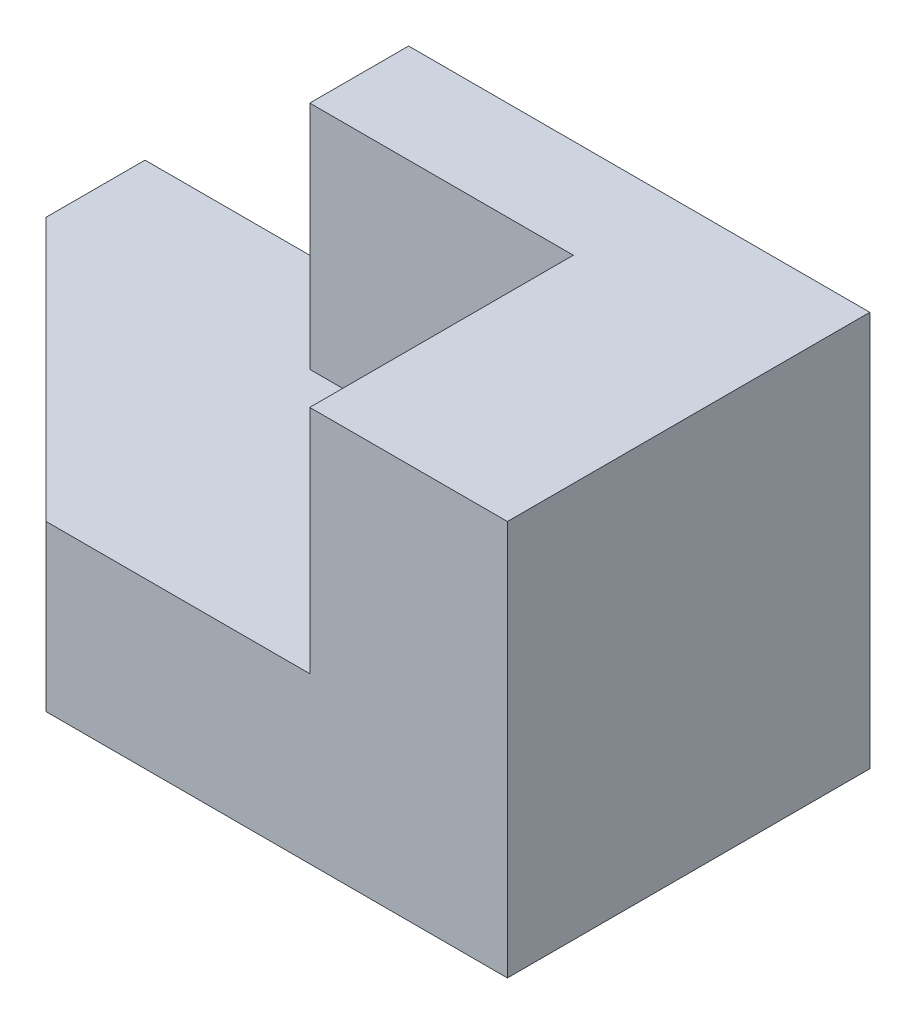
ISO-10303-21;
HEADER;
FILE_DESCRIPTION(('STEP AP214'),'2;1');
FILE_NAME('part.step','',(''),(''),'','','');
FILE_SCHEMA(('AUTOMOTIVE_DESIGN { 1 0 10303 214 1 1 1 1 }'));
ENDSEC;
DATA;
#1=APPLICATION_CONTEXT('core data for automotive mechanical design processes');
#2=APPLICATION_PROTOCOL_DEFINITION('international standard','automotive_design',2000,#1);
#3=PRODUCT_CONTEXT('',#1,'mechanical');
#4=PRODUCT('Part','Part','',(#3));
#5=PRODUCT_RELATED_PRODUCT_CATEGORY('part','',(#4));
#6=PRODUCT_DEFINITION_FORMATION('','',#4);
#7=PRODUCT_DEFINITION_CONTEXT('part definition',#1,'design');
#8=PRODUCT_DEFINITION('design','',#6,#7);
#9=PRODUCT_DEFINITION_SHAPE('','',#8);
#10=(LENGTH_UNIT() NAMED_UNIT(*) SI_UNIT(.MILLI.,.METRE.));
#11=(NAMED_UNIT(*) PLANE_ANGLE_UNIT() SI_UNIT($,.RADIAN.));
#12=(NAMED_UNIT(*) SI_UNIT($,.STERADIAN.) SOLID_ANGLE_UNIT());
#13=UNCERTAINTY_MEASURE_WITH_UNIT(LENGTH_MEASURE(1.E-05),#10,'distance_accuracy_value','');
#14=(GEOMETRIC_REPRESENTATION_CONTEXT(3) GLOBAL_UNCERTAINTY_ASSIGNED_CONTEXT((#13)) GLOBAL_UNIT_ASSIGNED_CONTEXT((#10,
#11,#12)) REPRESENTATION_CONTEXT('',''));
#15=CARTESIAN_POINT('',(0.,0.,0.));
#16=DIRECTION('',(0.,0.,1.));
#17=DIRECTION('',(1.,0.,0.));
#18=AXIS2_PLACEMENT_3D('',#15,#16,#17);
#19=CARTESIAN_POINT('',(0.,25.,55.));
#20=DIRECTION('',(1.,0.,0.));
#21=DIRECTION('',(0.,1.,0.));
#22=AXIS2_PLACEMENT_3D('',#19,#20,#21);
#23=PLANE('',#22);
#24=DIRECTION('',(0.,0.,-1.));
#25=VECTOR('',#24,1.);
#26=CARTESIAN_POINT('',(0.,25.,55.));
#27=LINE('',#26,#25);
#28=CARTESIAN_POINT('',(0.,25.,15.));
#29=VERTEX_POINT('',#28);
#30=CARTESIAN_POINT('',(0.,25.,0.));
#31=VERTEX_POINT('',#30);
#32=EDGE_CURVE('E11',#29,#31,#27,.T.);
#33=ORIENTED_EDGE('',*,*,#32,.F.);
#34=DIRECTION('',(0.,1.,0.));
#35=VECTOR('',#34,1.);
#36=CARTESIAN_POINT('',(0.,60.,15.));
#37=LINE('',#36,#35);
#38=CARTESIAN_POINT('',(0.,60.,15.));
#39=VERTEX_POINT('',#38);
#40=EDGE_CURVE('E165',#29,#39,#37,.T.);
#41=ORIENTED_EDGE('',*,*,#40,.T.);
#42=DIRECTION('',(0.,0.,-1.));
#43=VECTOR('',#42,1.);
#44=CARTESIAN_POINT('',(0.,60.,15.));
#45=LINE('',#44,#43);
#46=CARTESIAN_POINT('',(0.,60.,0.));
#47=VERTEX_POINT('',#46);
#48=EDGE_CURVE('E172',#39,#47,#45,.T.);
#49=ORIENTED_EDGE('',*,*,#48,.T.);
#50=DIRECTION('',(0.,-1.,0.));
#51=VECTOR('',#50,1.);
#52=CARTESIAN_POINT('',(0.,25.,0.));
#53=LINE('',#52,#51);
#54=EDGE_CURVE('E126',#47,#31,#53,.T.);
#55=ORIENTED_EDGE('',*,*,#54,.T.);
#56=EDGE_LOOP('',(#33,#41,#49,#55));
#57=FACE_BOUND('',#56,.T.);
#58=ADVANCED_FACE('F40',(#57),#23,.F.);
#59=CARTESIAN_POINT('',(40.,25.,55.));
#60=DIRECTION('',(0.,-1.,0.));
#61=DIRECTION('',(1.,0.,0.));
#62=AXIS2_PLACEMENT_3D('',#59,#60,#61);
#63=PLANE('',#62);
#64=DIRECTION('',(0.,0.,-1.));
#65=VECTOR('',#64,1.);
#66=CARTESIAN_POINT('',(40.,25.,55.));
#67=LINE('',#66,#65);
#68=CARTESIAN_POINT('',(40.,25.,55.));
#69=VERTEX_POINT('',#68);
#70=CARTESIAN_POINT('',(40.,25.,15.));
#71=VERTEX_POINT('',#70);
#72=EDGE_CURVE('E195',#69,#71,#67,.T.);
#73=ORIENTED_EDGE('',*,*,#72,.T.);
#74=DIRECTION('',(-1.,0.,0.));
#75=VECTOR('',#74,1.);
#76=CARTESIAN_POINT('',(0.,25.,15.));
#77=LINE('',#76,#75);
#78=EDGE_CURVE('E162',#71,#29,#77,.T.);
#79=ORIENTED_EDGE('',*,*,#78,.T.);
#80=ORIENTED_EDGE('',*,*,#32,.T.);
#81=DIRECTION('',(-1.,0.,0.));
#82=VECTOR('',#81,1.);
#83=CARTESIAN_POINT('',(0.,25.,0.));
#84=LINE('',#83,#82);
#85=CARTESIAN_POINT('',(-40.,25.,0.));
#86=VERTEX_POINT('',#85);
#87=EDGE_CURVE('E151',#31,#86,#84,.T.);
#88=ORIENTED_EDGE('',*,*,#87,.T.);
#89=DIRECTION('',(0.,0.,1.));
#90=VECTOR('',#89,1.);
#91=CARTESIAN_POINT('',(-40.,25.,0.));
#92=LINE('',#91,#90);
#93=CARTESIAN_POINT('',(-40.,25.,15.));
#94=VERTEX_POINT('',#93);
#95=EDGE_CURVE('E134',#86,#94,#92,.T.);
#96=ORIENTED_EDGE('',*,*,#95,.T.);
#97=DIRECTION('',(0.707106781186547,0.,0.707106781186548));
#98=VECTOR('',#97,1.);
#99=CARTESIAN_POINT('',(-40.,25.,15.));
#100=LINE('',#99,#98);
#101=CARTESIAN_POINT('',(0.,25.,55.));
#102=VERTEX_POINT('',#101);
#103=EDGE_CURVE('E148',#94,#102,#100,.T.);
#104=ORIENTED_EDGE('',*,*,#103,.T.);
#105=DIRECTION('',(-1.,0.,0.));
#106=VECTOR('',#105,1.);
#107=CARTESIAN_POINT('',(40.,25.,55.));
#108=LINE('',#107,#106);
#109=EDGE_CURVE('E176',#69,#102,#108,.T.);
#110=ORIENTED_EDGE('',*,*,#109,.F.);
#111=EDGE_LOOP('',(#73,#79,#80,#88,#96,#104,#110));
#112=FACE_BOUND('',#111,.T.);
#113=ADVANCED_FACE('F42',(#112),#63,.F.);
#114=CARTESIAN_POINT('',(0.,0.,55.));
#115=DIRECTION('',(0.,1.,0.));
#116=DIRECTION('',(0.,0.,1.));
#117=AXIS2_PLACEMENT_3D('',#114,#115,#116);
#118=PLANE('',#117);
#119=DIRECTION('',(1.,0.,0.));
#120=VECTOR('',#119,1.);
#121=CARTESIAN_POINT('',(0.,0.,0.));
#122=LINE('',#121,#120);
#123=CARTESIAN_POINT('',(-40.,0.,0.));
#124=VERTEX_POINT('',#123);
#125=CARTESIAN_POINT('',(70.,0.,0.));
#126=VERTEX_POINT('',#125);
#127=EDGE_CURVE('E112',#124,#126,#122,.T.);
#128=ORIENTED_EDGE('',*,*,#127,.T.);
#129=DIRECTION('',(0.,0.,-1.));
#130=VECTOR('',#129,1.);
#131=CARTESIAN_POINT('',(70.,0.,55.));
#132=LINE('',#131,#130);
#133=CARTESIAN_POINT('',(70.,0.,55.));
#134=VERTEX_POINT('',#133);
#135=EDGE_CURVE('E44',#134,#126,#132,.T.);
#136=ORIENTED_EDGE('',*,*,#135,.F.);
#137=DIRECTION('',(1.,0.,0.));
#138=VECTOR('',#137,1.);
#139=CARTESIAN_POINT('',(0.,0.,55.));
#140=LINE('',#139,#138);
#141=CARTESIAN_POINT('',(0.,0.,55.));
#142=VERTEX_POINT('',#141);
#143=EDGE_CURVE('E183',#142,#134,#140,.T.);
#144=ORIENTED_EDGE('',*,*,#143,.F.);
#145=DIRECTION('',(0.707106781186547,0.,0.707106781186548));
#146=VECTOR('',#145,1.);
#147=CARTESIAN_POINT('',(-40.,0.,15.));
#148=LINE('',#147,#146);
#149=CARTESIAN_POINT('',(-40.,0.,15.));
#150=VERTEX_POINT('',#149);
#151=EDGE_CURVE('E142',#150,#142,#148,.T.);
#152=ORIENTED_EDGE('',*,*,#151,.F.);
#153=DIRECTION('',(0.,0.,1.));
#154=VECTOR('',#153,1.);
#155=CARTESIAN_POINT('',(-40.,0.,0.));
#156=LINE('',#155,#154);
#157=EDGE_CURVE('E132',#124,#150,#156,.T.);
#158=ORIENTED_EDGE('',*,*,#157,.F.);
#159=EDGE_LOOP('',(#128,#136,#144,#152,#158));
#160=FACE_BOUND('',#159,.T.);
#161=ADVANCED_FACE('F139',(#160),#118,.F.);
#162=CARTESIAN_POINT('',(70.,0.,55.));
#163=DIRECTION('',(-1.,0.,0.));
#164=DIRECTION('',(0.,0.,1.));
#165=AXIS2_PLACEMENT_3D('',#162,#163,#164);
#166=PLANE('',#165);
#167=DIRECTION('',(0.,1.,0.));
#168=VECTOR('',#167,1.);
#169=CARTESIAN_POINT('',(70.,0.,0.));
#170=LINE('',#169,#168);
#171=CARTESIAN_POINT('',(70.,60.,0.));
#172=VERTEX_POINT('',#171);
#173=EDGE_CURVE('E120',#126,#172,#170,.T.);
#174=ORIENTED_EDGE('',*,*,#173,.T.);
#175=DIRECTION('',(0.,0.,-1.));
#176=VECTOR('',#175,1.);
#177=CARTESIAN_POINT('',(70.,60.,55.));
#178=LINE('',#177,#176);
#179=CARTESIAN_POINT('',(70.,60.,55.));
#180=VERTEX_POINT('',#179);
#181=EDGE_CURVE('E206',#180,#172,#178,.T.);
#182=ORIENTED_EDGE('',*,*,#181,.F.);
#183=DIRECTION('',(0.,1.,0.));
#184=VECTOR('',#183,1.);
#185=CARTESIAN_POINT('',(70.,0.,55.));
#186=LINE('',#185,#184);
#187=EDGE_CURVE('E186',#134,#180,#186,.T.);
#188=ORIENTED_EDGE('',*,*,#187,.F.);
#189=ORIENTED_EDGE('',*,*,#135,.T.);
#190=EDGE_LOOP('',(#174,#182,#188,#189));
#191=FACE_BOUND('',#190,.T.);
#192=ADVANCED_FACE('F215',(#191),#166,.F.);
#193=CARTESIAN_POINT('',(70.,60.,55.));
#194=DIRECTION('',(0.,-1.,0.));
#195=DIRECTION('',(1.,0.,0.));
#196=AXIS2_PLACEMENT_3D('',#193,#194,#195);
#197=PLANE('',#196);
#198=DIRECTION('',(-1.,0.,0.));
#199=VECTOR('',#198,1.);
#200=CARTESIAN_POINT('',(70.,60.,0.));
#201=LINE('',#200,#199);
#202=EDGE_CURVE('E180',#172,#47,#201,.T.);
#203=ORIENTED_EDGE('',*,*,#202,.T.);
#204=ORIENTED_EDGE('',*,*,#48,.F.);
#205=DIRECTION('',(1.,0.,0.));
#206=VECTOR('',#205,1.);
#207=CARTESIAN_POINT('',(40.,60.,15.));
#208=LINE('',#207,#206);
#209=CARTESIAN_POINT('',(40.,60.,15.));
#210=VERTEX_POINT('',#209);
#211=EDGE_CURVE('E168',#39,#210,#208,.T.);
#212=ORIENTED_EDGE('',*,*,#211,.T.);
#213=DIRECTION('',(0.,0.,-1.));
#214=VECTOR('',#213,1.);
#215=CARTESIAN_POINT('',(40.,60.,55.));
#216=LINE('',#215,#214);
#217=CARTESIAN_POINT('',(40.,60.,55.));
#218=VERTEX_POINT('',#217);
#219=EDGE_CURVE('E63',#218,#210,#216,.T.);
#220=ORIENTED_EDGE('',*,*,#219,.F.);
#221=DIRECTION('',(-1.,0.,0.));
#222=VECTOR('',#221,1.);
#223=CARTESIAN_POINT('',(70.,60.,55.));
#224=LINE('',#223,#222);
#225=EDGE_CURVE('E189',#180,#218,#224,.T.);
#226=ORIENTED_EDGE('',*,*,#225,.F.);
#227=ORIENTED_EDGE('',*,*,#181,.T.);
#228=EDGE_LOOP('',(#203,#204,#212,#220,#226,#227));
#229=FACE_BOUND('',#228,.T.);
#230=ADVANCED_FACE('F225',(#229),#197,.F.);
#231=CARTESIAN_POINT('',(40.,60.,55.));
#232=DIRECTION('',(1.,0.,0.));
#233=DIRECTION('',(0.,1.,0.));
#234=AXIS2_PLACEMENT_3D('',#231,#232,#233);
#235=PLANE('',#234);
#236=ORIENTED_EDGE('',*,*,#219,.T.);
#237=DIRECTION('',(0.,-1.,0.));
#238=VECTOR('',#237,1.);
#239=CARTESIAN_POINT('',(40.,25.,15.));
#240=LINE('',#239,#238);
#241=EDGE_CURVE('E158',#210,#71,#240,.T.);
#242=ORIENTED_EDGE('',*,*,#241,.T.);
#243=ORIENTED_EDGE('',*,*,#72,.F.);
#244=DIRECTION('',(0.,-1.,0.));
#245=VECTOR('',#244,1.);
#246=CARTESIAN_POINT('',(40.,60.,55.));
#247=LINE('',#246,#245);
#248=EDGE_CURVE('E192',#218,#69,#247,.T.);
#249=ORIENTED_EDGE('',*,*,#248,.F.);
#250=EDGE_LOOP('',(#236,#242,#243,#249));
#251=FACE_BOUND('',#250,.T.);
#252=ADVANCED_FACE('F230',(#251),#235,.F.);
#253=CARTESIAN_POINT('',(0.,0.,55.));
#254=DIRECTION('',(0.,0.,1.));
#255=DIRECTION('',(1.,0.,0.));
#256=AXIS2_PLACEMENT_3D('',#253,#254,#255);
#257=PLANE('',#256);
#258=ORIENTED_EDGE('',*,*,#109,.T.);
#259=DIRECTION('',(0.,-1.,0.));
#260=VECTOR('',#259,1.);
#261=CARTESIAN_POINT('',(0.,25.,55.));
#262=LINE('',#261,#260);
#263=EDGE_CURVE('E179',#102,#142,#262,.T.);
#264=ORIENTED_EDGE('',*,*,#263,.T.);
#265=ORIENTED_EDGE('',*,*,#143,.T.);
#266=ORIENTED_EDGE('',*,*,#187,.T.);
#267=ORIENTED_EDGE('',*,*,#225,.T.);
#268=ORIENTED_EDGE('',*,*,#248,.T.);
#269=EDGE_LOOP('',(#258,#264,#265,#266,#267,#268));
#270=FACE_BOUND('',#269,.T.);
#271=ADVANCED_FACE('F231',(#270),#257,.T.);
#272=CARTESIAN_POINT('',(0.,0.,0.));
#273=DIRECTION('',(0.,0.,1.));
#274=DIRECTION('',(1.,0.,0.));
#275=AXIS2_PLACEMENT_3D('',#272,#273,#274);
#276=PLANE('',#275);
#277=ORIENTED_EDGE('',*,*,#54,.F.);
#278=ORIENTED_EDGE('',*,*,#202,.F.);
#279=ORIENTED_EDGE('',*,*,#173,.F.);
#280=ORIENTED_EDGE('',*,*,#127,.F.);
#281=DIRECTION('',(0.,1.,0.));
#282=VECTOR('',#281,1.);
#283=CARTESIAN_POINT('',(-40.,0.,0.));
#284=LINE('',#283,#282);
#285=EDGE_CURVE('E117',#124,#86,#284,.T.);
#286=ORIENTED_EDGE('',*,*,#285,.T.);
#287=ORIENTED_EDGE('',*,*,#87,.F.);
#288=EDGE_LOOP('',(#277,#278,#279,#280,#286,#287));
#289=FACE_BOUND('',#288,.T.);
#290=ADVANCED_FACE('F115',(#289),#276,.F.);
#291=CARTESIAN_POINT('',(0.,0.,15.));
#292=DIRECTION('',(0.,0.,1.));
#293=DIRECTION('',(1.,0.,0.));
#294=AXIS2_PLACEMENT_3D('',#291,#292,#293);
#295=PLANE('',#294);
#296=ORIENTED_EDGE('',*,*,#241,.F.);
#297=ORIENTED_EDGE('',*,*,#211,.F.);
#298=ORIENTED_EDGE('',*,*,#40,.F.);
#299=ORIENTED_EDGE('',*,*,#78,.F.);
#300=EDGE_LOOP('',(#296,#297,#298,#299));
#301=FACE_BOUND('',#300,.T.);
#302=ADVANCED_FACE('F227',(#301),#295,.T.);
#303=CARTESIAN_POINT('',(-40.,0.,15.));
#304=DIRECTION('',(-0.707106781186548,0.,0.707106781186547));
#305=DIRECTION('',(0.707106781186547,0.,0.707106781186548));
#306=AXIS2_PLACEMENT_3D('',#303,#304,#305);
#307=PLANE('',#306);
#308=ORIENTED_EDGE('',*,*,#103,.F.);
#309=DIRECTION('',(0.,1.,0.));
#310=VECTOR('',#309,1.);
#311=CARTESIAN_POINT('',(-40.,0.,15.));
#312=LINE('',#311,#310);
#313=EDGE_CURVE('E136',#150,#94,#312,.T.);
#314=ORIENTED_EDGE('',*,*,#313,.F.);
#315=ORIENTED_EDGE('',*,*,#151,.T.);
#316=ORIENTED_EDGE('',*,*,#263,.F.);
#317=EDGE_LOOP('',(#308,#314,#315,#316));
#318=FACE_BOUND('',#317,.T.);
#319=ADVANCED_FACE('F220',(#318),#307,.T.);
#320=CARTESIAN_POINT('',(-40.,0.,0.));
#321=DIRECTION('',(-1.,0.,0.));
#322=DIRECTION('',(0.,-1.,0.));
#323=AXIS2_PLACEMENT_3D('',#320,#321,#322);
#324=PLANE('',#323);
#325=ORIENTED_EDGE('',*,*,#95,.F.);
#326=ORIENTED_EDGE('',*,*,#285,.F.);
#327=ORIENTED_EDGE('',*,*,#157,.T.);
#328=ORIENTED_EDGE('',*,*,#313,.T.);
#329=EDGE_LOOP('',(#325,#326,#327,#328));
#330=FACE_BOUND('',#329,.T.);
#331=ADVANCED_FACE('F131',(#330),#324,.T.);
#332=CLOSED_SHELL('',(#58,#113,#161,#192,#230,#252,#271,#290,#302,#319,#331));
#333=MANIFOLD_SOLID_BREP('B2',#332);
#334=ADVANCED_BREP_SHAPE_REPRESENTATION('',(#18,#333),#14);
#335=SHAPE_DEFINITION_REPRESENTATION(#9,#334);
ENDSEC;
END-ISO-10303-21;
